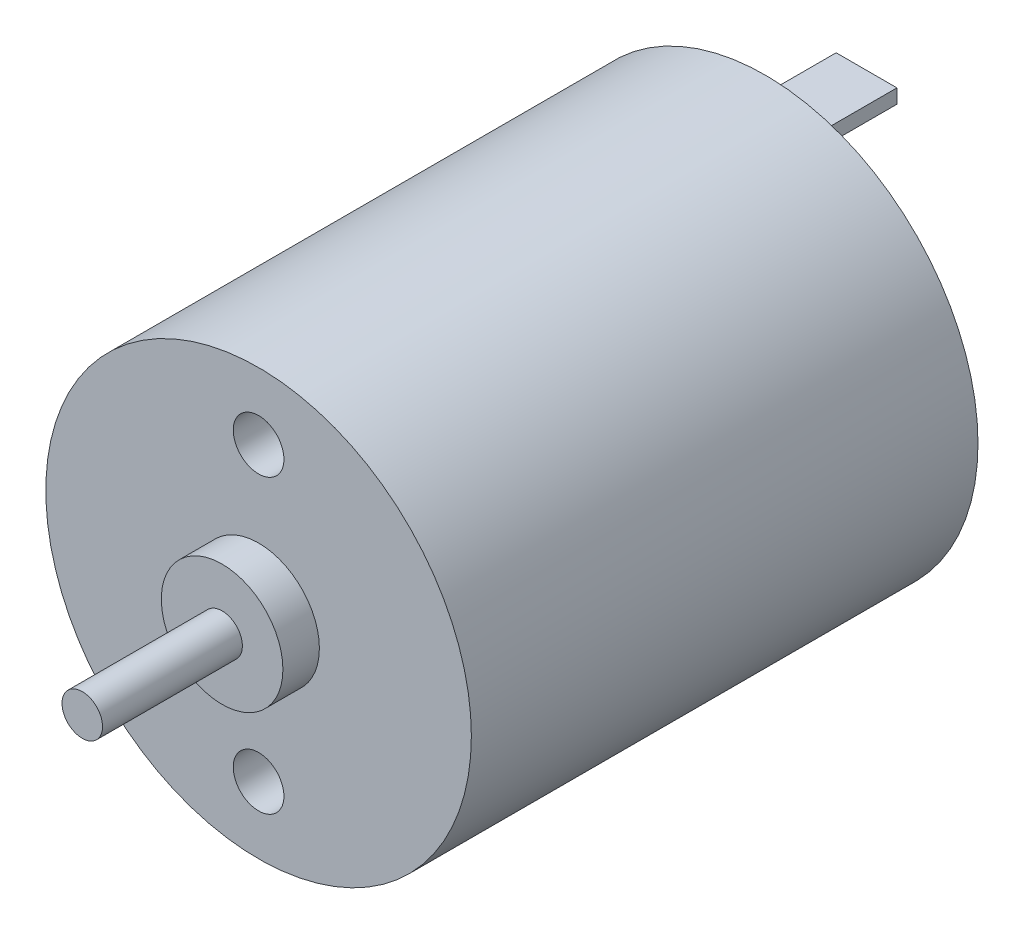
ISO-10303-21;
HEADER;
FILE_DESCRIPTION(('STEP AP214'),'2;1');
FILE_NAME('part.step','',(''),(''),'','','');
FILE_SCHEMA(('AUTOMOTIVE_DESIGN { 1 0 10303 214 1 1 1 1 }'));
ENDSEC;
DATA;
#1=APPLICATION_CONTEXT('core data for automotive mechanical design processes');
#2=APPLICATION_PROTOCOL_DEFINITION('international standard','automotive_design',2000,#1);
#3=PRODUCT_CONTEXT('',#1,'mechanical');
#4=PRODUCT('Part','Part','',(#3));
#5=PRODUCT_RELATED_PRODUCT_CATEGORY('part','',(#4));
#6=PRODUCT_DEFINITION_FORMATION('','',#4);
#7=PRODUCT_DEFINITION_CONTEXT('part definition',#1,'design');
#8=PRODUCT_DEFINITION('design','',#6,#7);
#9=PRODUCT_DEFINITION_SHAPE('','',#8);
#10=(LENGTH_UNIT() NAMED_UNIT(*) SI_UNIT(.MILLI.,.METRE.));
#11=(NAMED_UNIT(*) PLANE_ANGLE_UNIT() SI_UNIT($,.RADIAN.));
#12=(NAMED_UNIT(*) SI_UNIT($,.STERADIAN.) SOLID_ANGLE_UNIT());
#13=UNCERTAINTY_MEASURE_WITH_UNIT(LENGTH_MEASURE(1.E-05),#10,'distance_accuracy_value','');
#14=(GEOMETRIC_REPRESENTATION_CONTEXT(3) GLOBAL_UNCERTAINTY_ASSIGNED_CONTEXT((#13)) GLOBAL_UNIT_ASSIGNED_CONTEXT((#10,
#11,#12)) REPRESENTATION_CONTEXT('',''));
#15=CARTESIAN_POINT('',(0.,0.,0.));
#16=DIRECTION('',(0.,0.,1.));
#17=DIRECTION('',(1.,0.,0.));
#18=AXIS2_PLACEMENT_3D('',#15,#16,#17);
#19=CARTESIAN_POINT('',(0.,0.,0.));
#20=DIRECTION('',(0.,0.,1.));
#21=DIRECTION('',(1.,0.,0.));
#22=AXIS2_PLACEMENT_3D('',#19,#20,#21);
#23=PLANE('',#22);
#24=DIRECTION('',(0.,-1.,0.));
#25=VECTOR('',#24,1.);
#26=CARTESIAN_POINT('',(1.5,8.2,0.));
#27=LINE('',#26,#25);
#28=CARTESIAN_POINT('',(1.5,8.2,0.));
#29=VERTEX_POINT('',#28);
#30=CARTESIAN_POINT('',(1.5,7.5,0.));
#31=VERTEX_POINT('',#30);
#32=EDGE_CURVE('E107',#29,#31,#27,.T.);
#33=ORIENTED_EDGE('',*,*,#32,.F.);
#34=DIRECTION('',(1.,0.,0.));
#35=VECTOR('',#34,1.);
#36=CARTESIAN_POINT('',(1.5,8.2,0.));
#37=LINE('',#36,#35);
#38=CARTESIAN_POINT('',(-1.5,8.2,0.));
#39=VERTEX_POINT('',#38);
#40=EDGE_CURVE('E140',#39,#29,#37,.T.);
#41=ORIENTED_EDGE('',*,*,#40,.F.);
#42=DIRECTION('',(0.,1.,0.));
#43=VECTOR('',#42,1.);
#44=CARTESIAN_POINT('',(-1.5,8.2,0.));
#45=LINE('',#44,#43);
#46=CARTESIAN_POINT('',(-1.5,7.5,0.));
#47=VERTEX_POINT('',#46);
#48=EDGE_CURVE('E152',#47,#39,#45,.T.);
#49=ORIENTED_EDGE('',*,*,#48,.F.);
#50=DIRECTION('',(-1.,0.,0.));
#51=VECTOR('',#50,1.);
#52=CARTESIAN_POINT('',(1.5,7.5,0.));
#53=LINE('',#52,#51);
#54=EDGE_CURVE('E149',#31,#47,#53,.T.);
#55=ORIENTED_EDGE('',*,*,#54,.F.);
#56=EDGE_LOOP('',(#33,#41,#49,#55));
#57=FACE_BOUND('',#56,.T.);
#58=CARTESIAN_POINT('',(0.,0.,0.));
#59=DIRECTION('',(0.,0.,1.));
#60=DIRECTION('',(1.,0.,0.));
#61=AXIS2_PLACEMENT_3D('',#58,#59,#60);
#62=CIRCLE('',#61,3.);
#63=CARTESIAN_POINT('',(3.,0.,0.));
#64=VERTEX_POINT('',#63);
#65=EDGE_CURVE('E168',#64,#64,#62,.T.);
#66=ORIENTED_EDGE('',*,*,#65,.T.);
#67=EDGE_LOOP('',(#66));
#68=FACE_BOUND('',#67,.T.);
#69=CARTESIAN_POINT('',(0.,0.,0.));
#70=DIRECTION('',(0.,0.,1.));
#71=DIRECTION('',(1.,0.,0.));
#72=AXIS2_PLACEMENT_3D('',#69,#70,#71);
#73=CIRCLE('',#72,10.5);
#74=CARTESIAN_POINT('',(10.5,0.,0.));
#75=VERTEX_POINT('',#74);
#76=EDGE_CURVE('E179',#75,#75,#73,.T.);
#77=ORIENTED_EDGE('',*,*,#76,.F.);
#78=EDGE_LOOP('',(#77));
#79=FACE_BOUND('',#78,.T.);
#80=DIRECTION('',(0.,-1.,0.));
#81=VECTOR('',#80,1.);
#82=CARTESIAN_POINT('',(1.5,-7.5,0.));
#83=LINE('',#82,#81);
#84=CARTESIAN_POINT('',(1.5,-7.5,0.));
#85=VERTEX_POINT('',#84);
#86=CARTESIAN_POINT('',(1.5,-8.2,0.));
#87=VERTEX_POINT('',#86);
#88=EDGE_CURVE('E101',#85,#87,#83,.T.);
#89=ORIENTED_EDGE('',*,*,#88,.F.);
#90=DIRECTION('',(1.,0.,0.));
#91=VECTOR('',#90,1.);
#92=CARTESIAN_POINT('',(1.5,-7.5,0.));
#93=LINE('',#92,#91);
#94=CARTESIAN_POINT('',(-1.5,-7.5,0.));
#95=VERTEX_POINT('',#94);
#96=EDGE_CURVE('E103',#95,#85,#93,.T.);
#97=ORIENTED_EDGE('',*,*,#96,.F.);
#98=DIRECTION('',(0.,1.,0.));
#99=VECTOR('',#98,1.);
#100=CARTESIAN_POINT('',(-1.5,-7.5,0.));
#101=LINE('',#100,#99);
#102=CARTESIAN_POINT('',(-1.5,-8.2,0.));
#103=VERTEX_POINT('',#102);
#104=EDGE_CURVE('E60',#103,#95,#101,.T.);
#105=ORIENTED_EDGE('',*,*,#104,.F.);
#106=DIRECTION('',(-1.,0.,0.));
#107=VECTOR('',#106,1.);
#108=CARTESIAN_POINT('',(1.5,-8.2,0.));
#109=LINE('',#108,#107);
#110=EDGE_CURVE('E55',#87,#103,#109,.T.);
#111=ORIENTED_EDGE('',*,*,#110,.F.);
#112=EDGE_LOOP('',(#89,#97,#105,#111));
#113=FACE_BOUND('',#112,.T.);
#114=ADVANCED_FACE('F38',(#57,#68,#79,#113),#23,.F.);
#115=CARTESIAN_POINT('',(0.,0.,25.));
#116=DIRECTION('',(0.,0.,-1.));
#117=DIRECTION('',(-1.,0.,0.));
#118=AXIS2_PLACEMENT_3D('',#115,#116,#117);
#119=CYLINDRICAL_SURFACE('',#118,10.5);
#120=CARTESIAN_POINT('',(0.,0.,25.));
#121=DIRECTION('',(0.,0.,1.));
#122=DIRECTION('',(1.,0.,0.));
#123=AXIS2_PLACEMENT_3D('',#120,#121,#122);
#124=CIRCLE('',#123,10.5);
#125=CARTESIAN_POINT('',(10.5,0.,25.));
#126=VERTEX_POINT('',#125);
#127=EDGE_CURVE('E47',#126,#126,#124,.T.);
#128=ORIENTED_EDGE('',*,*,#127,.F.);
#129=EDGE_LOOP('',(#128));
#130=FACE_BOUND('',#129,.T.);
#131=ORIENTED_EDGE('',*,*,#76,.T.);
#132=EDGE_LOOP('',(#131));
#133=FACE_BOUND('',#132,.T.);
#134=ADVANCED_FACE('F40',(#130,#133),#119,.T.);
#135=CARTESIAN_POINT('',(0.,0.,25.));
#136=DIRECTION('',(0.,0.,1.));
#137=DIRECTION('',(1.,0.,0.));
#138=AXIS2_PLACEMENT_3D('',#135,#136,#137);
#139=PLANE('',#138);
#140=CARTESIAN_POINT('',(0.,7.2,25.));
#141=DIRECTION('',(0.,0.,1.));
#142=DIRECTION('',(1.,0.,0.));
#143=AXIS2_PLACEMENT_3D('',#140,#141,#142);
#144=CIRCLE('',#143,1.25);
#145=CARTESIAN_POINT('',(1.25,7.2,25.));
#146=VERTEX_POINT('',#145);
#147=EDGE_CURVE('E281',#146,#146,#144,.T.);
#148=ORIENTED_EDGE('',*,*,#147,.F.);
#149=EDGE_LOOP('',(#148));
#150=FACE_BOUND('',#149,.T.);
#151=CARTESIAN_POINT('',(0.,-7.2,25.));
#152=DIRECTION('',(0.,0.,1.));
#153=DIRECTION('',(1.,0.,0.));
#154=AXIS2_PLACEMENT_3D('',#151,#152,#153);
#155=CIRCLE('',#154,1.25);
#156=CARTESIAN_POINT('',(1.25,-7.2,25.));
#157=VERTEX_POINT('',#156);
#158=EDGE_CURVE('E285',#157,#157,#155,.T.);
#159=ORIENTED_EDGE('',*,*,#158,.F.);
#160=EDGE_LOOP('',(#159));
#161=FACE_BOUND('',#160,.T.);
#162=CARTESIAN_POINT('',(0.,0.,25.));
#163=DIRECTION('',(0.,0.,1.));
#164=DIRECTION('',(1.,0.,0.));
#165=AXIS2_PLACEMENT_3D('',#162,#163,#164);
#166=CIRCLE('',#165,3.);
#167=CARTESIAN_POINT('',(3.,0.,25.));
#168=VERTEX_POINT('',#167);
#169=EDGE_CURVE('E11',#168,#168,#166,.T.);
#170=ORIENTED_EDGE('',*,*,#169,.F.);
#171=EDGE_LOOP('',(#170));
#172=FACE_BOUND('',#171,.T.);
#173=ORIENTED_EDGE('',*,*,#127,.T.);
#174=EDGE_LOOP('',(#173));
#175=FACE_BOUND('',#174,.T.);
#176=ADVANCED_FACE('F193',(#150,#161,#172,#175),#139,.T.);
#177=CARTESIAN_POINT('',(0.,0.,26.8));
#178=DIRECTION('',(0.,0.,-1.));
#179=DIRECTION('',(-1.,0.,0.));
#180=AXIS2_PLACEMENT_3D('',#177,#178,#179);
#181=CYLINDRICAL_SURFACE('',#180,3.);
#182=CARTESIAN_POINT('',(0.,0.,26.8));
#183=DIRECTION('',(0.,0.,1.));
#184=DIRECTION('',(1.,0.,0.));
#185=AXIS2_PLACEMENT_3D('',#182,#183,#184);
#186=CIRCLE('',#185,3.);
#187=CARTESIAN_POINT('',(3.,0.,26.8));
#188=VERTEX_POINT('',#187);
#189=EDGE_CURVE('E177',#188,#188,#186,.T.);
#190=ORIENTED_EDGE('',*,*,#189,.F.);
#191=EDGE_LOOP('',(#190));
#192=FACE_BOUND('',#191,.T.);
#193=ORIENTED_EDGE('',*,*,#169,.T.);
#194=EDGE_LOOP('',(#193));
#195=FACE_BOUND('',#194,.T.);
#196=ADVANCED_FACE('F199',(#192,#195),#181,.T.);
#197=CARTESIAN_POINT('',(0.,0.,26.8));
#198=DIRECTION('',(0.,0.,1.));
#199=DIRECTION('',(1.,0.,0.));
#200=AXIS2_PLACEMENT_3D('',#197,#198,#199);
#201=PLANE('',#200);
#202=CARTESIAN_POINT('',(0.,0.,26.8));
#203=DIRECTION('',(0.,0.,1.));
#204=DIRECTION('',(1.,0.,0.));
#205=AXIS2_PLACEMENT_3D('',#202,#203,#204);
#206=CIRCLE('',#205,1.);
#207=CARTESIAN_POINT('',(1.,0.,26.8));
#208=VERTEX_POINT('',#207);
#209=EDGE_CURVE('E42',#208,#208,#206,.F.);
#210=ORIENTED_EDGE('',*,*,#209,.T.);
#211=EDGE_LOOP('',(#210));
#212=FACE_BOUND('',#211,.T.);
#213=ORIENTED_EDGE('',*,*,#189,.T.);
#214=EDGE_LOOP('',(#213));
#215=FACE_BOUND('',#214,.T.);
#216=ADVANCED_FACE('F203',(#212,#215),#201,.T.);
#217=CARTESIAN_POINT('',(0.,0.,33.7));
#218=DIRECTION('',(0.,0.,-1.));
#219=DIRECTION('',(-1.,0.,0.));
#220=AXIS2_PLACEMENT_3D('',#217,#218,#219);
#221=CYLINDRICAL_SURFACE('',#220,1.);
#222=ORIENTED_EDGE('',*,*,#209,.F.);
#223=EDGE_LOOP('',(#222));
#224=FACE_BOUND('',#223,.T.);
#225=CARTESIAN_POINT('',(0.,0.,33.7));
#226=DIRECTION('',(0.,0.,1.));
#227=DIRECTION('',(1.,0.,0.));
#228=AXIS2_PLACEMENT_3D('',#225,#226,#227);
#229=CIRCLE('',#228,1.);
#230=CARTESIAN_POINT('',(1.,0.,33.7));
#231=VERTEX_POINT('',#230);
#232=EDGE_CURVE('E172',#231,#231,#229,.T.);
#233=ORIENTED_EDGE('',*,*,#232,.F.);
#234=EDGE_LOOP('',(#233));
#235=FACE_BOUND('',#234,.T.);
#236=ADVANCED_FACE('F207',(#224,#235),#221,.T.);
#237=CARTESIAN_POINT('',(0.,0.,33.7));
#238=DIRECTION('',(0.,0.,1.));
#239=DIRECTION('',(1.,0.,0.));
#240=AXIS2_PLACEMENT_3D('',#237,#238,#239);
#241=PLANE('',#240);
#242=ORIENTED_EDGE('',*,*,#232,.T.);
#243=EDGE_LOOP('',(#242));
#244=FACE_BOUND('',#243,.T.);
#245=ADVANCED_FACE('F211',(#244),#241,.T.);
#246=CARTESIAN_POINT('',(0.,0.,-2.6));
#247=DIRECTION('',(0.,0.,1.));
#248=DIRECTION('',(1.,0.,0.));
#249=AXIS2_PLACEMENT_3D('',#246,#247,#248);
#250=CYLINDRICAL_SURFACE('',#249,3.);
#251=CARTESIAN_POINT('',(0.,0.,-2.6));
#252=DIRECTION('',(0.,0.,1.));
#253=DIRECTION('',(1.,0.,0.));
#254=AXIS2_PLACEMENT_3D('',#251,#252,#253);
#255=CIRCLE('',#254,3.);
#256=CARTESIAN_POINT('',(3.,0.,-2.6));
#257=VERTEX_POINT('',#256);
#258=EDGE_CURVE('E169',#257,#257,#255,.T.);
#259=ORIENTED_EDGE('',*,*,#258,.T.);
#260=EDGE_LOOP('',(#259));
#261=FACE_BOUND('',#260,.T.);
#262=ORIENTED_EDGE('',*,*,#65,.F.);
#263=EDGE_LOOP('',(#262));
#264=FACE_BOUND('',#263,.T.);
#265=ADVANCED_FACE('F215',(#261,#264),#250,.T.);
#266=CARTESIAN_POINT('',(0.,0.,-2.6));
#267=DIRECTION('',(0.,0.,1.));
#268=DIRECTION('',(1.,0.,0.));
#269=AXIS2_PLACEMENT_3D('',#266,#267,#268);
#270=PLANE('',#269);
#271=ORIENTED_EDGE('',*,*,#258,.F.);
#272=EDGE_LOOP('',(#271));
#273=FACE_BOUND('',#272,.T.);
#274=ADVANCED_FACE('F219',(#273),#270,.F.);
#275=CARTESIAN_POINT('',(1.5,8.2,-5.));
#276=DIRECTION('',(-1.,0.,0.));
#277=DIRECTION('',(0.,-1.,0.));
#278=AXIS2_PLACEMENT_3D('',#275,#276,#277);
#279=PLANE('',#278);
#280=ORIENTED_EDGE('',*,*,#32,.T.);
#281=DIRECTION('',(0.,0.,1.));
#282=VECTOR('',#281,1.);
#283=CARTESIAN_POINT('',(1.5,7.5,-5.));
#284=LINE('',#283,#282);
#285=CARTESIAN_POINT('',(1.5,7.5,-5.));
#286=VERTEX_POINT('',#285);
#287=EDGE_CURVE('E165',#286,#31,#284,.T.);
#288=ORIENTED_EDGE('',*,*,#287,.F.);
#289=DIRECTION('',(0.,-1.,0.));
#290=VECTOR('',#289,1.);
#291=CARTESIAN_POINT('',(1.5,8.2,-5.));
#292=LINE('',#291,#290);
#293=CARTESIAN_POINT('',(1.5,8.2,-5.));
#294=VERTEX_POINT('',#293);
#295=EDGE_CURVE('E136',#294,#286,#292,.T.);
#296=ORIENTED_EDGE('',*,*,#295,.F.);
#297=DIRECTION('',(0.,0.,1.));
#298=VECTOR('',#297,1.);
#299=CARTESIAN_POINT('',(1.5,8.2,-5.));
#300=LINE('',#299,#298);
#301=EDGE_CURVE('E146',#294,#29,#300,.T.);
#302=ORIENTED_EDGE('',*,*,#301,.T.);
#303=EDGE_LOOP('',(#280,#288,#296,#302));
#304=FACE_BOUND('',#303,.T.);
#305=ADVANCED_FACE('F223',(#304),#279,.F.);
#306=CARTESIAN_POINT('',(1.5,7.5,-5.));
#307=DIRECTION('',(0.,1.,0.));
#308=DIRECTION('',(0.,0.,1.));
#309=AXIS2_PLACEMENT_3D('',#306,#307,#308);
#310=PLANE('',#309);
#311=ORIENTED_EDGE('',*,*,#54,.T.);
#312=DIRECTION('',(0.,0.,1.));
#313=VECTOR('',#312,1.);
#314=CARTESIAN_POINT('',(-1.5,7.5,-5.));
#315=LINE('',#314,#313);
#316=CARTESIAN_POINT('',(-1.5,7.5,-5.));
#317=VERTEX_POINT('',#316);
#318=EDGE_CURVE('E162',#317,#47,#315,.T.);
#319=ORIENTED_EDGE('',*,*,#318,.F.);
#320=DIRECTION('',(-1.,0.,0.));
#321=VECTOR('',#320,1.);
#322=CARTESIAN_POINT('',(1.5,7.5,-5.));
#323=LINE('',#322,#321);
#324=EDGE_CURVE('E139',#286,#317,#323,.T.);
#325=ORIENTED_EDGE('',*,*,#324,.F.);
#326=ORIENTED_EDGE('',*,*,#287,.T.);
#327=EDGE_LOOP('',(#311,#319,#325,#326));
#328=FACE_BOUND('',#327,.T.);
#329=ADVANCED_FACE('F227',(#328),#310,.F.);
#330=CARTESIAN_POINT('',(-1.5,8.2,-5.));
#331=DIRECTION('',(1.,0.,0.));
#332=DIRECTION('',(0.,1.,0.));
#333=AXIS2_PLACEMENT_3D('',#330,#331,#332);
#334=PLANE('',#333);
#335=ORIENTED_EDGE('',*,*,#48,.T.);
#336=DIRECTION('',(0.,0.,1.));
#337=VECTOR('',#336,1.);
#338=CARTESIAN_POINT('',(-1.5,8.2,-5.));
#339=LINE('',#338,#337);
#340=CARTESIAN_POINT('',(-1.5,8.2,-5.));
#341=VERTEX_POINT('',#340);
#342=EDGE_CURVE('E159',#341,#39,#339,.T.);
#343=ORIENTED_EDGE('',*,*,#342,.F.);
#344=DIRECTION('',(0.,1.,0.));
#345=VECTOR('',#344,1.);
#346=CARTESIAN_POINT('',(-1.5,8.2,-5.));
#347=LINE('',#346,#345);
#348=EDGE_CURVE('E142',#317,#341,#347,.T.);
#349=ORIENTED_EDGE('',*,*,#348,.F.);
#350=ORIENTED_EDGE('',*,*,#318,.T.);
#351=EDGE_LOOP('',(#335,#343,#349,#350));
#352=FACE_BOUND('',#351,.T.);
#353=ADVANCED_FACE('F231',(#352),#334,.F.);
#354=CARTESIAN_POINT('',(1.5,8.2,-5.));
#355=DIRECTION('',(0.,-1.,0.));
#356=DIRECTION('',(0.,0.,-1.));
#357=AXIS2_PLACEMENT_3D('',#354,#355,#356);
#358=PLANE('',#357);
#359=ORIENTED_EDGE('',*,*,#40,.T.);
#360=ORIENTED_EDGE('',*,*,#301,.F.);
#361=DIRECTION('',(1.,0.,0.));
#362=VECTOR('',#361,1.);
#363=CARTESIAN_POINT('',(1.5,8.2,-5.));
#364=LINE('',#363,#362);
#365=EDGE_CURVE('E144',#341,#294,#364,.T.);
#366=ORIENTED_EDGE('',*,*,#365,.F.);
#367=ORIENTED_EDGE('',*,*,#342,.T.);
#368=EDGE_LOOP('',(#359,#360,#366,#367));
#369=FACE_BOUND('',#368,.T.);
#370=ADVANCED_FACE('F235',(#369),#358,.F.);
#371=CARTESIAN_POINT('',(0.,0.,-5.));
#372=DIRECTION('',(0.,0.,-1.));
#373=DIRECTION('',(-1.,0.,0.));
#374=AXIS2_PLACEMENT_3D('',#371,#372,#373);
#375=PLANE('',#374);
#376=ORIENTED_EDGE('',*,*,#295,.T.);
#377=ORIENTED_EDGE('',*,*,#324,.T.);
#378=ORIENTED_EDGE('',*,*,#348,.T.);
#379=ORIENTED_EDGE('',*,*,#365,.T.);
#380=EDGE_LOOP('',(#376,#377,#378,#379));
#381=FACE_BOUND('',#380,.T.);
#382=ADVANCED_FACE('F239',(#381),#375,.T.);
#383=CARTESIAN_POINT('',(1.5,-7.5,-5.));
#384=DIRECTION('',(-1.,0.,0.));
#385=DIRECTION('',(0.,0.,1.));
#386=AXIS2_PLACEMENT_3D('',#383,#384,#385);
#387=PLANE('',#386);
#388=ORIENTED_EDGE('',*,*,#88,.T.);
#389=DIRECTION('',(0.,0.,1.));
#390=VECTOR('',#389,1.);
#391=CARTESIAN_POINT('',(1.5,-8.2,-5.));
#392=LINE('',#391,#390);
#393=CARTESIAN_POINT('',(1.5,-8.2,-5.));
#394=VERTEX_POINT('',#393);
#395=EDGE_CURVE('E280',#394,#87,#392,.T.);
#396=ORIENTED_EDGE('',*,*,#395,.F.);
#397=DIRECTION('',(0.,-1.,0.));
#398=VECTOR('',#397,1.);
#399=CARTESIAN_POINT('',(1.5,-7.5,-5.));
#400=LINE('',#399,#398);
#401=CARTESIAN_POINT('',(1.5,-7.5,-5.));
#402=VERTEX_POINT('',#401);
#403=EDGE_CURVE('E118',#402,#394,#400,.T.);
#404=ORIENTED_EDGE('',*,*,#403,.F.);
#405=DIRECTION('',(0.,0.,1.));
#406=VECTOR('',#405,1.);
#407=CARTESIAN_POINT('',(1.5,-7.5,-5.));
#408=LINE('',#407,#406);
#409=EDGE_CURVE('E114',#402,#85,#408,.T.);
#410=ORIENTED_EDGE('',*,*,#409,.T.);
#411=EDGE_LOOP('',(#388,#396,#404,#410));
#412=FACE_BOUND('',#411,.T.);
#413=ADVANCED_FACE('F120',(#412),#387,.F.);
#414=CARTESIAN_POINT('',(1.5,-8.2,-5.));
#415=DIRECTION('',(0.,1.,0.));
#416=DIRECTION('',(0.,0.,1.));
#417=AXIS2_PLACEMENT_3D('',#414,#415,#416);
#418=PLANE('',#417);
#419=ORIENTED_EDGE('',*,*,#110,.T.);
#420=DIRECTION('',(0.,0.,1.));
#421=VECTOR('',#420,1.);
#422=CARTESIAN_POINT('',(-1.5,-8.2,-5.));
#423=LINE('',#422,#421);
#424=CARTESIAN_POINT('',(-1.5,-8.2,-5.));
#425=VERTEX_POINT('',#424);
#426=EDGE_CURVE('E126',#425,#103,#423,.T.);
#427=ORIENTED_EDGE('',*,*,#426,.F.);
#428=DIRECTION('',(-1.,0.,0.));
#429=VECTOR('',#428,1.);
#430=CARTESIAN_POINT('',(1.5,-8.2,-5.));
#431=LINE('',#430,#429);
#432=EDGE_CURVE('E133',#394,#425,#431,.T.);
#433=ORIENTED_EDGE('',*,*,#432,.F.);
#434=ORIENTED_EDGE('',*,*,#395,.T.);
#435=EDGE_LOOP('',(#419,#427,#433,#434));
#436=FACE_BOUND('',#435,.T.);
#437=ADVANCED_FACE('F254',(#436),#418,.F.);
#438=CARTESIAN_POINT('',(-1.5,-7.5,-5.));
#439=DIRECTION('',(1.,0.,0.));
#440=DIRECTION('',(0.,0.,-1.));
#441=AXIS2_PLACEMENT_3D('',#438,#439,#440);
#442=PLANE('',#441);
#443=ORIENTED_EDGE('',*,*,#104,.T.);
#444=DIRECTION('',(0.,0.,1.));
#445=VECTOR('',#444,1.);
#446=CARTESIAN_POINT('',(-1.5,-7.5,-5.));
#447=LINE('',#446,#445);
#448=CARTESIAN_POINT('',(-1.5,-7.5,-5.));
#449=VERTEX_POINT('',#448);
#450=EDGE_CURVE('E117',#449,#95,#447,.T.);
#451=ORIENTED_EDGE('',*,*,#450,.F.);
#452=DIRECTION('',(0.,1.,0.));
#453=VECTOR('',#452,1.);
#454=CARTESIAN_POINT('',(-1.5,-7.5,-5.));
#455=LINE('',#454,#453);
#456=EDGE_CURVE('E124',#425,#449,#455,.T.);
#457=ORIENTED_EDGE('',*,*,#456,.F.);
#458=ORIENTED_EDGE('',*,*,#426,.T.);
#459=EDGE_LOOP('',(#443,#451,#457,#458));
#460=FACE_BOUND('',#459,.T.);
#461=ADVANCED_FACE('F251',(#460),#442,.F.);
#462=CARTESIAN_POINT('',(1.5,-7.5,-5.));
#463=DIRECTION('',(0.,-1.,0.));
#464=DIRECTION('',(0.,0.,-1.));
#465=AXIS2_PLACEMENT_3D('',#462,#463,#464);
#466=PLANE('',#465);
#467=ORIENTED_EDGE('',*,*,#96,.T.);
#468=ORIENTED_EDGE('',*,*,#409,.F.);
#469=DIRECTION('',(1.,0.,0.));
#470=VECTOR('',#469,1.);
#471=CARTESIAN_POINT('',(1.5,-7.5,-5.));
#472=LINE('',#471,#470);
#473=EDGE_CURVE('E122',#449,#402,#472,.T.);
#474=ORIENTED_EDGE('',*,*,#473,.F.);
#475=ORIENTED_EDGE('',*,*,#450,.T.);
#476=EDGE_LOOP('',(#467,#468,#474,#475));
#477=FACE_BOUND('',#476,.T.);
#478=ADVANCED_FACE('F112',(#477),#466,.F.);
#479=CARTESIAN_POINT('',(0.,0.,-5.));
#480=DIRECTION('',(0.,0.,-1.));
#481=DIRECTION('',(-1.,0.,0.));
#482=AXIS2_PLACEMENT_3D('',#479,#480,#481);
#483=PLANE('',#482);
#484=ORIENTED_EDGE('',*,*,#403,.T.);
#485=ORIENTED_EDGE('',*,*,#432,.T.);
#486=ORIENTED_EDGE('',*,*,#456,.T.);
#487=ORIENTED_EDGE('',*,*,#473,.T.);
#488=EDGE_LOOP('',(#484,#485,#486,#487));
#489=FACE_BOUND('',#488,.T.);
#490=ADVANCED_FACE('F244',(#489),#483,.T.);
#491=CARTESIAN_POINT('',(0.,-7.2,20.));
#492=DIRECTION('',(0.,0.,1.));
#493=DIRECTION('',(1.,0.,0.));
#494=AXIS2_PLACEMENT_3D('',#491,#492,#493);
#495=CYLINDRICAL_SURFACE('',#494,1.25);
#496=CARTESIAN_POINT('',(0.,-7.2,20.));
#497=DIRECTION('',(0.,0.,1.));
#498=DIRECTION('',(1.,0.,0.));
#499=AXIS2_PLACEMENT_3D('',#496,#497,#498);
#500=CIRCLE('',#499,1.25);
#501=CARTESIAN_POINT('',(1.25,-7.2,20.));
#502=VERTEX_POINT('',#501);
#503=EDGE_CURVE('E290',#502,#502,#500,.T.);
#504=ORIENTED_EDGE('',*,*,#503,.F.);
#505=EDGE_LOOP('',(#504));
#506=FACE_BOUND('',#505,.T.);
#507=ORIENTED_EDGE('',*,*,#158,.T.);
#508=EDGE_LOOP('',(#507));
#509=FACE_BOUND('',#508,.T.);
#510=ADVANCED_FACE('F247',(#506,#509),#495,.F.);
#511=CARTESIAN_POINT('',(0.,-7.2,20.));
#512=DIRECTION('',(0.,0.,1.));
#513=DIRECTION('',(1.,0.,0.));
#514=AXIS2_PLACEMENT_3D('',#511,#512,#513);
#515=PLANE('',#514);
#516=ORIENTED_EDGE('',*,*,#503,.T.);
#517=EDGE_LOOP('',(#516));
#518=FACE_BOUND('',#517,.T.);
#519=ADVANCED_FACE('F261',(#518),#515,.T.);
#520=CARTESIAN_POINT('',(0.,7.2,20.));
#521=DIRECTION('',(0.,0.,1.));
#522=DIRECTION('',(1.,0.,0.));
#523=AXIS2_PLACEMENT_3D('',#520,#521,#522);
#524=CYLINDRICAL_SURFACE('',#523,1.25);
#525=CARTESIAN_POINT('',(0.,7.2,20.));
#526=DIRECTION('',(0.,0.,1.));
#527=DIRECTION('',(1.,0.,0.));
#528=AXIS2_PLACEMENT_3D('',#525,#526,#527);
#529=CIRCLE('',#528,1.25);
#530=CARTESIAN_POINT('',(1.25,7.2,20.));
#531=VERTEX_POINT('',#530);
#532=EDGE_CURVE('E279',#531,#531,#529,.T.);
#533=ORIENTED_EDGE('',*,*,#532,.F.);
#534=EDGE_LOOP('',(#533));
#535=FACE_BOUND('',#534,.T.);
#536=ORIENTED_EDGE('',*,*,#147,.T.);
#537=EDGE_LOOP('',(#536));
#538=FACE_BOUND('',#537,.T.);
#539=ADVANCED_FACE('F264',(#535,#538),#524,.F.);
#540=CARTESIAN_POINT('',(0.,7.2,20.));
#541=DIRECTION('',(0.,0.,1.));
#542=DIRECTION('',(1.,0.,0.));
#543=AXIS2_PLACEMENT_3D('',#540,#541,#542);
#544=PLANE('',#543);
#545=ORIENTED_EDGE('',*,*,#532,.T.);
#546=EDGE_LOOP('',(#545));
#547=FACE_BOUND('',#546,.T.);
#548=ADVANCED_FACE('F271',(#547),#544,.T.);
#549=CLOSED_SHELL('',(#114,#134,#176,#196,#216,#236,#245,#265,#274,#305,#329,#353,#370,#382,
#413,#437,#461,#478,#490,#510,#519,#539,#548));
#550=MANIFOLD_SOLID_BREP('B2',#549);
#551=ADVANCED_BREP_SHAPE_REPRESENTATION('',(#18,#550),#14);
#552=SHAPE_DEFINITION_REPRESENTATION(#9,#551);
ENDSEC;
END-ISO-10303-21;
